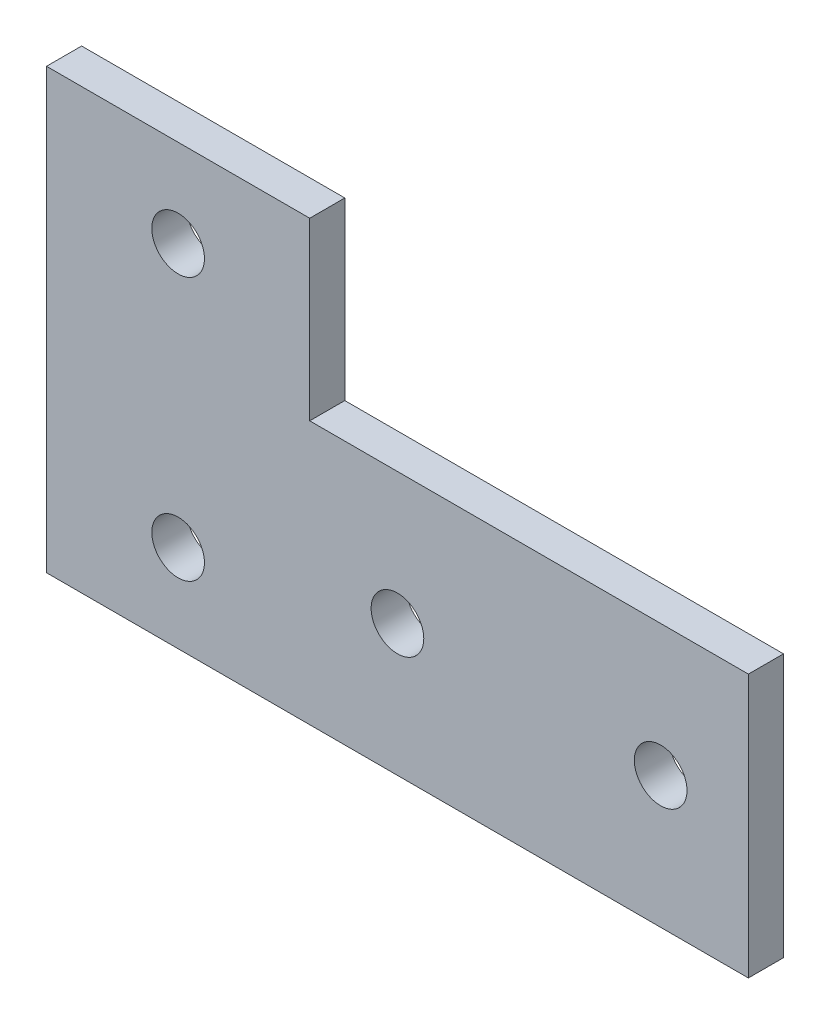
ISO-10303-21;
HEADER;
FILE_DESCRIPTION(('STEP AP214'),'2;1');
FILE_NAME('part.step','',(''),(''),'','','');
FILE_SCHEMA(('AUTOMOTIVE_DESIGN { 1 0 10303 214 1 1 1 1 }'));
ENDSEC;
DATA;
#1=APPLICATION_CONTEXT('core data for automotive mechanical design processes');
#2=APPLICATION_PROTOCOL_DEFINITION('international standard','automotive_design',2000,#1);
#3=PRODUCT_CONTEXT('',#1,'mechanical');
#4=PRODUCT('Part','Part','',(#3));
#5=PRODUCT_RELATED_PRODUCT_CATEGORY('part','',(#4));
#6=PRODUCT_DEFINITION_FORMATION('','',#4);
#7=PRODUCT_DEFINITION_CONTEXT('part definition',#1,'design');
#8=PRODUCT_DEFINITION('design','',#6,#7);
#9=PRODUCT_DEFINITION_SHAPE('','',#8);
#10=(LENGTH_UNIT() NAMED_UNIT(*) SI_UNIT(.MILLI.,.METRE.));
#11=(NAMED_UNIT(*) PLANE_ANGLE_UNIT() SI_UNIT($,.RADIAN.));
#12=(NAMED_UNIT(*) SI_UNIT($,.STERADIAN.) SOLID_ANGLE_UNIT());
#13=UNCERTAINTY_MEASURE_WITH_UNIT(LENGTH_MEASURE(1.E-05),#10,'distance_accuracy_value','');
#14=(GEOMETRIC_REPRESENTATION_CONTEXT(3) GLOBAL_UNCERTAINTY_ASSIGNED_CONTEXT((#13)) GLOBAL_UNIT_ASSIGNED_CONTEXT((#10,
#11,#12)) REPRESENTATION_CONTEXT('',''));
#15=CARTESIAN_POINT('',(0.,0.,0.));
#16=DIRECTION('',(0.,0.,1.));
#17=DIRECTION('',(1.,0.,0.));
#18=AXIS2_PLACEMENT_3D('',#15,#16,#17);
#19=CARTESIAN_POINT('',(0.,0.,2.));
#20=DIRECTION('',(1.,0.,0.));
#21=DIRECTION('',(0.,0.,-1.));
#22=AXIS2_PLACEMENT_3D('',#19,#20,#21);
#23=PLANE('',#22);
#24=DIRECTION('',(0.,-1.,0.));
#25=VECTOR('',#24,1.);
#26=CARTESIAN_POINT('',(0.,0.,0.));
#27=LINE('',#26,#25);
#28=CARTESIAN_POINT('',(0.,25.,0.));
#29=VERTEX_POINT('',#28);
#30=CARTESIAN_POINT('',(0.,0.,0.));
#31=VERTEX_POINT('',#30);
#32=EDGE_CURVE('E115',#29,#31,#27,.T.);
#33=ORIENTED_EDGE('',*,*,#32,.T.);
#34=DIRECTION('',(0.,0.,-1.));
#35=VECTOR('',#34,1.);
#36=CARTESIAN_POINT('',(0.,0.,2.));
#37=LINE('',#36,#35);
#38=CARTESIAN_POINT('',(0.,0.,2.));
#39=VERTEX_POINT('',#38);
#40=EDGE_CURVE('E11',#39,#31,#37,.T.);
#41=ORIENTED_EDGE('',*,*,#40,.F.);
#42=DIRECTION('',(0.,-1.,0.));
#43=VECTOR('',#42,1.);
#44=CARTESIAN_POINT('',(0.,0.,2.));
#45=LINE('',#44,#43);
#46=CARTESIAN_POINT('',(0.,25.,2.));
#47=VERTEX_POINT('',#46);
#48=EDGE_CURVE('E126',#47,#39,#45,.T.);
#49=ORIENTED_EDGE('',*,*,#48,.F.);
#50=DIRECTION('',(0.,0.,-1.));
#51=VECTOR('',#50,1.);
#52=CARTESIAN_POINT('',(0.,25.,2.));
#53=LINE('',#52,#51);
#54=EDGE_CURVE('E111',#47,#29,#53,.T.);
#55=ORIENTED_EDGE('',*,*,#54,.T.);
#56=EDGE_LOOP('',(#33,#41,#49,#55));
#57=FACE_BOUND('',#56,.T.);
#58=ADVANCED_FACE('F31',(#57),#23,.F.);
#59=CARTESIAN_POINT('',(15.,0.,2.));
#60=DIRECTION('',(0.,1.,0.));
#61=DIRECTION('',(0.,0.,1.));
#62=AXIS2_PLACEMENT_3D('',#59,#60,#61);
#63=PLANE('',#62);
#64=DIRECTION('',(1.,0.,0.));
#65=VECTOR('',#64,1.);
#66=CARTESIAN_POINT('',(15.,0.,0.));
#67=LINE('',#66,#65);
#68=CARTESIAN_POINT('',(40.,0.,0.));
#69=VERTEX_POINT('',#68);
#70=EDGE_CURVE('E118',#31,#69,#67,.T.);
#71=ORIENTED_EDGE('',*,*,#70,.T.);
#72=DIRECTION('',(0.,0.,-1.));
#73=VECTOR('',#72,1.);
#74=CARTESIAN_POINT('',(40.,0.,2.));
#75=LINE('',#74,#73);
#76=CARTESIAN_POINT('',(40.,0.,2.));
#77=VERTEX_POINT('',#76);
#78=EDGE_CURVE('E39',#77,#69,#75,.T.);
#79=ORIENTED_EDGE('',*,*,#78,.F.);
#80=DIRECTION('',(1.,0.,0.));
#81=VECTOR('',#80,1.);
#82=CARTESIAN_POINT('',(0.,0.,2.));
#83=LINE('',#82,#81);
#84=EDGE_CURVE('E84',#39,#77,#83,.T.);
#85=ORIENTED_EDGE('',*,*,#84,.F.);
#86=ORIENTED_EDGE('',*,*,#40,.T.);
#87=EDGE_LOOP('',(#71,#79,#85,#86));
#88=FACE_BOUND('',#87,.T.);
#89=ADVANCED_FACE('F151',(#88),#63,.F.);
#90=CARTESIAN_POINT('',(40.,0.,2.));
#91=DIRECTION('',(-1.,0.,0.));
#92=DIRECTION('',(0.,0.,1.));
#93=AXIS2_PLACEMENT_3D('',#90,#91,#92);
#94=PLANE('',#93);
#95=DIRECTION('',(0.,1.,0.));
#96=VECTOR('',#95,1.);
#97=CARTESIAN_POINT('',(40.,0.,0.));
#98=LINE('',#97,#96);
#99=CARTESIAN_POINT('',(40.,15.,0.));
#100=VERTEX_POINT('',#99);
#101=EDGE_CURVE('E121',#69,#100,#98,.T.);
#102=ORIENTED_EDGE('',*,*,#101,.T.);
#103=DIRECTION('',(0.,0.,-1.));
#104=VECTOR('',#103,1.);
#105=CARTESIAN_POINT('',(40.,15.,2.));
#106=LINE('',#105,#104);
#107=CARTESIAN_POINT('',(40.,15.,2.));
#108=VERTEX_POINT('',#107);
#109=EDGE_CURVE('E106',#108,#100,#106,.T.);
#110=ORIENTED_EDGE('',*,*,#109,.F.);
#111=DIRECTION('',(0.,1.,0.));
#112=VECTOR('',#111,1.);
#113=CARTESIAN_POINT('',(40.,0.,2.));
#114=LINE('',#113,#112);
#115=EDGE_CURVE('E97',#77,#108,#114,.T.);
#116=ORIENTED_EDGE('',*,*,#115,.F.);
#117=ORIENTED_EDGE('',*,*,#78,.T.);
#118=EDGE_LOOP('',(#102,#110,#116,#117));
#119=FACE_BOUND('',#118,.T.);
#120=ADVANCED_FACE('F132',(#119),#94,.F.);
#121=CARTESIAN_POINT('',(15.,15.,2.));
#122=DIRECTION('',(0.,-1.,0.));
#123=DIRECTION('',(0.,0.,-1.));
#124=AXIS2_PLACEMENT_3D('',#121,#122,#123);
#125=PLANE('',#124);
#126=DIRECTION('',(-1.,0.,0.));
#127=VECTOR('',#126,1.);
#128=CARTESIAN_POINT('',(15.,15.,0.));
#129=LINE('',#128,#127);
#130=CARTESIAN_POINT('',(15.,15.,0.));
#131=VERTEX_POINT('',#130);
#132=EDGE_CURVE('E105',#100,#131,#129,.T.);
#133=ORIENTED_EDGE('',*,*,#132,.T.);
#134=DIRECTION('',(0.,0.,-1.));
#135=VECTOR('',#134,1.);
#136=CARTESIAN_POINT('',(15.,15.,2.));
#137=LINE('',#136,#135);
#138=CARTESIAN_POINT('',(15.,15.,2.));
#139=VERTEX_POINT('',#138);
#140=EDGE_CURVE('E102',#139,#131,#137,.T.);
#141=ORIENTED_EDGE('',*,*,#140,.F.);
#142=DIRECTION('',(-1.,0.,0.));
#143=VECTOR('',#142,1.);
#144=CARTESIAN_POINT('',(15.,15.,2.));
#145=LINE('',#144,#143);
#146=EDGE_CURVE('E91',#108,#139,#145,.T.);
#147=ORIENTED_EDGE('',*,*,#146,.F.);
#148=ORIENTED_EDGE('',*,*,#109,.T.);
#149=EDGE_LOOP('',(#133,#141,#147,#148));
#150=FACE_BOUND('',#149,.T.);
#151=ADVANCED_FACE('F103',(#150),#125,.F.);
#152=CARTESIAN_POINT('',(15.,15.,2.));
#153=DIRECTION('',(-1.,0.,0.));
#154=DIRECTION('',(0.,0.,1.));
#155=AXIS2_PLACEMENT_3D('',#152,#153,#154);
#156=PLANE('',#155);
#157=DIRECTION('',(0.,1.,0.));
#158=VECTOR('',#157,1.);
#159=CARTESIAN_POINT('',(15.,15.,0.));
#160=LINE('',#159,#158);
#161=CARTESIAN_POINT('',(15.,25.,0.));
#162=VERTEX_POINT('',#161);
#163=EDGE_CURVE('E70',#131,#162,#160,.T.);
#164=ORIENTED_EDGE('',*,*,#163,.T.);
#165=DIRECTION('',(0.,0.,-1.));
#166=VECTOR('',#165,1.);
#167=CARTESIAN_POINT('',(15.,25.,2.));
#168=LINE('',#167,#166);
#169=CARTESIAN_POINT('',(15.,25.,2.));
#170=VERTEX_POINT('',#169);
#171=EDGE_CURVE('E107',#170,#162,#168,.T.);
#172=ORIENTED_EDGE('',*,*,#171,.F.);
#173=DIRECTION('',(0.,1.,0.));
#174=VECTOR('',#173,1.);
#175=CARTESIAN_POINT('',(15.,15.,2.));
#176=LINE('',#175,#174);
#177=EDGE_CURVE('E95',#139,#170,#176,.T.);
#178=ORIENTED_EDGE('',*,*,#177,.F.);
#179=ORIENTED_EDGE('',*,*,#140,.T.);
#180=EDGE_LOOP('',(#164,#172,#178,#179));
#181=FACE_BOUND('',#180,.T.);
#182=ADVANCED_FACE('F109',(#181),#156,.F.);
#183=CARTESIAN_POINT('',(0.,25.,2.));
#184=DIRECTION('',(0.,-1.,0.));
#185=DIRECTION('',(0.,0.,-1.));
#186=AXIS2_PLACEMENT_3D('',#183,#184,#185);
#187=PLANE('',#186);
#188=DIRECTION('',(-1.,0.,0.));
#189=VECTOR('',#188,1.);
#190=CARTESIAN_POINT('',(0.,25.,0.));
#191=LINE('',#190,#189);
#192=EDGE_CURVE('E76',#162,#29,#191,.T.);
#193=ORIENTED_EDGE('',*,*,#192,.T.);
#194=ORIENTED_EDGE('',*,*,#54,.F.);
#195=DIRECTION('',(-1.,0.,0.));
#196=VECTOR('',#195,1.);
#197=CARTESIAN_POINT('',(0.,25.,2.));
#198=LINE('',#197,#196);
#199=EDGE_CURVE('E47',#170,#47,#198,.T.);
#200=ORIENTED_EDGE('',*,*,#199,.F.);
#201=ORIENTED_EDGE('',*,*,#171,.T.);
#202=EDGE_LOOP('',(#193,#194,#200,#201));
#203=FACE_BOUND('',#202,.T.);
#204=ADVANCED_FACE('F139',(#203),#187,.F.);
#205=CARTESIAN_POINT('',(0.,25.,2.));
#206=DIRECTION('',(0.,0.,-1.));
#207=DIRECTION('',(-1.,0.,0.));
#208=AXIS2_PLACEMENT_3D('',#205,#206,#207);
#209=PLANE('',#208);
#210=CARTESIAN_POINT('',(35.,7.5,2.));
#211=DIRECTION('',(0.,0.,1.));
#212=DIRECTION('',(1.,0.,0.));
#213=AXIS2_PLACEMENT_3D('',#210,#211,#212);
#214=CIRCLE('',#213,1.5);
#215=CARTESIAN_POINT('',(36.5,7.5,2.));
#216=VERTEX_POINT('',#215);
#217=EDGE_CURVE('E237',#216,#216,#214,.T.);
#218=ORIENTED_EDGE('',*,*,#217,.F.);
#219=EDGE_LOOP('',(#218));
#220=FACE_BOUND('',#219,.T.);
#221=CARTESIAN_POINT('',(20.,7.5,2.));
#222=DIRECTION('',(0.,0.,1.));
#223=DIRECTION('',(1.,0.,0.));
#224=AXIS2_PLACEMENT_3D('',#221,#222,#223);
#225=CIRCLE('',#224,1.5);
#226=CARTESIAN_POINT('',(21.5,7.5,2.));
#227=VERTEX_POINT('',#226);
#228=EDGE_CURVE('E239',#227,#227,#225,.T.);
#229=ORIENTED_EDGE('',*,*,#228,.F.);
#230=EDGE_LOOP('',(#229));
#231=FACE_BOUND('',#230,.T.);
#232=CARTESIAN_POINT('',(7.5,5.,2.));
#233=DIRECTION('',(0.,0.,1.));
#234=DIRECTION('',(1.,0.,0.));
#235=AXIS2_PLACEMENT_3D('',#232,#233,#234);
#236=CIRCLE('',#235,1.5);
#237=CARTESIAN_POINT('',(9.,5.,2.));
#238=VERTEX_POINT('',#237);
#239=EDGE_CURVE('E245',#238,#238,#236,.T.);
#240=ORIENTED_EDGE('',*,*,#239,.F.);
#241=EDGE_LOOP('',(#240));
#242=FACE_BOUND('',#241,.T.);
#243=CARTESIAN_POINT('',(7.5,20.,2.));
#244=DIRECTION('',(0.,0.,1.));
#245=DIRECTION('',(1.,0.,0.));
#246=AXIS2_PLACEMENT_3D('',#243,#244,#245);
#247=CIRCLE('',#246,1.5);
#248=CARTESIAN_POINT('',(9.,20.,2.));
#249=VERTEX_POINT('',#248);
#250=EDGE_CURVE('E251',#249,#249,#247,.T.);
#251=ORIENTED_EDGE('',*,*,#250,.F.);
#252=EDGE_LOOP('',(#251));
#253=FACE_BOUND('',#252,.T.);
#254=ORIENTED_EDGE('',*,*,#48,.T.);
#255=ORIENTED_EDGE('',*,*,#84,.T.);
#256=ORIENTED_EDGE('',*,*,#115,.T.);
#257=ORIENTED_EDGE('',*,*,#146,.T.);
#258=ORIENTED_EDGE('',*,*,#177,.T.);
#259=ORIENTED_EDGE('',*,*,#199,.T.);
#260=EDGE_LOOP('',(#254,#255,#256,#257,#258,#259));
#261=FACE_BOUND('',#260,.T.);
#262=ADVANCED_FACE('F93',(#220,#231,#242,#253,#261),#209,.F.);
#263=CARTESIAN_POINT('',(0.,25.,0.));
#264=DIRECTION('',(0.,0.,-1.));
#265=DIRECTION('',(-1.,0.,0.));
#266=AXIS2_PLACEMENT_3D('',#263,#264,#265);
#267=PLANE('',#266);
#268=CARTESIAN_POINT('',(35.,7.5,0.));
#269=DIRECTION('',(0.,0.,1.));
#270=DIRECTION('',(1.,0.,0.));
#271=AXIS2_PLACEMENT_3D('',#268,#269,#270);
#272=CIRCLE('',#271,1.5);
#273=CARTESIAN_POINT('',(36.5,7.5,0.));
#274=VERTEX_POINT('',#273);
#275=EDGE_CURVE('E234',#274,#274,#272,.T.);
#276=ORIENTED_EDGE('',*,*,#275,.T.);
#277=EDGE_LOOP('',(#276));
#278=FACE_BOUND('',#277,.T.);
#279=CARTESIAN_POINT('',(20.,7.5,0.));
#280=DIRECTION('',(0.,0.,1.));
#281=DIRECTION('',(1.,0.,0.));
#282=AXIS2_PLACEMENT_3D('',#279,#280,#281);
#283=CIRCLE('',#282,1.5);
#284=CARTESIAN_POINT('',(21.5,7.5,0.));
#285=VERTEX_POINT('',#284);
#286=EDGE_CURVE('E242',#285,#285,#283,.T.);
#287=ORIENTED_EDGE('',*,*,#286,.T.);
#288=EDGE_LOOP('',(#287));
#289=FACE_BOUND('',#288,.T.);
#290=CARTESIAN_POINT('',(7.5,5.,0.));
#291=DIRECTION('',(0.,0.,1.));
#292=DIRECTION('',(1.,0.,0.));
#293=AXIS2_PLACEMENT_3D('',#290,#291,#292);
#294=CIRCLE('',#293,1.5);
#295=CARTESIAN_POINT('',(9.,5.,0.));
#296=VERTEX_POINT('',#295);
#297=EDGE_CURVE('E248',#296,#296,#294,.T.);
#298=ORIENTED_EDGE('',*,*,#297,.T.);
#299=EDGE_LOOP('',(#298));
#300=FACE_BOUND('',#299,.T.);
#301=CARTESIAN_POINT('',(7.5,20.,0.));
#302=DIRECTION('',(0.,0.,1.));
#303=DIRECTION('',(1.,0.,0.));
#304=AXIS2_PLACEMENT_3D('',#301,#302,#303);
#305=CIRCLE('',#304,1.5);
#306=CARTESIAN_POINT('',(9.,20.,0.));
#307=VERTEX_POINT('',#306);
#308=EDGE_CURVE('E119',#307,#307,#305,.T.);
#309=ORIENTED_EDGE('',*,*,#308,.T.);
#310=EDGE_LOOP('',(#309));
#311=FACE_BOUND('',#310,.T.);
#312=ORIENTED_EDGE('',*,*,#32,.F.);
#313=ORIENTED_EDGE('',*,*,#192,.F.);
#314=ORIENTED_EDGE('',*,*,#163,.F.);
#315=ORIENTED_EDGE('',*,*,#132,.F.);
#316=ORIENTED_EDGE('',*,*,#101,.F.);
#317=ORIENTED_EDGE('',*,*,#70,.F.);
#318=EDGE_LOOP('',(#312,#313,#314,#315,#316,#317));
#319=FACE_BOUND('',#318,.T.);
#320=ADVANCED_FACE('F135',(#278,#289,#300,#311,#319),#267,.T.);
#321=CARTESIAN_POINT('',(7.5,20.,0.));
#322=DIRECTION('',(0.,0.,1.));
#323=DIRECTION('',(1.,0.,0.));
#324=AXIS2_PLACEMENT_3D('',#321,#322,#323);
#325=CYLINDRICAL_SURFACE('',#324,1.5);
#326=ORIENTED_EDGE('',*,*,#308,.F.);
#327=EDGE_LOOP('',(#326));
#328=FACE_BOUND('',#327,.T.);
#329=ORIENTED_EDGE('',*,*,#250,.T.);
#330=EDGE_LOOP('',(#329));
#331=FACE_BOUND('',#330,.T.);
#332=ADVANCED_FACE('F188',(#328,#331),#325,.F.);
#333=CARTESIAN_POINT('',(7.5,5.,0.));
#334=DIRECTION('',(0.,0.,1.));
#335=DIRECTION('',(1.,0.,0.));
#336=AXIS2_PLACEMENT_3D('',#333,#334,#335);
#337=CYLINDRICAL_SURFACE('',#336,1.5);
#338=ORIENTED_EDGE('',*,*,#297,.F.);
#339=EDGE_LOOP('',(#338));
#340=FACE_BOUND('',#339,.T.);
#341=ORIENTED_EDGE('',*,*,#239,.T.);
#342=EDGE_LOOP('',(#341));
#343=FACE_BOUND('',#342,.T.);
#344=ADVANCED_FACE('F197',(#340,#343),#337,.F.);
#345=CARTESIAN_POINT('',(20.,7.5,0.));
#346=DIRECTION('',(0.,0.,1.));
#347=DIRECTION('',(1.,0.,0.));
#348=AXIS2_PLACEMENT_3D('',#345,#346,#347);
#349=CYLINDRICAL_SURFACE('',#348,1.5);
#350=ORIENTED_EDGE('',*,*,#286,.F.);
#351=EDGE_LOOP('',(#350));
#352=FACE_BOUND('',#351,.T.);
#353=ORIENTED_EDGE('',*,*,#228,.T.);
#354=EDGE_LOOP('',(#353));
#355=FACE_BOUND('',#354,.T.);
#356=ADVANCED_FACE('F207',(#352,#355),#349,.F.);
#357=CARTESIAN_POINT('',(35.,7.5,0.));
#358=DIRECTION('',(0.,0.,1.));
#359=DIRECTION('',(1.,0.,0.));
#360=AXIS2_PLACEMENT_3D('',#357,#358,#359);
#361=CYLINDRICAL_SURFACE('',#360,1.5);
#362=ORIENTED_EDGE('',*,*,#275,.F.);
#363=EDGE_LOOP('',(#362));
#364=FACE_BOUND('',#363,.T.);
#365=ORIENTED_EDGE('',*,*,#217,.T.);
#366=EDGE_LOOP('',(#365));
#367=FACE_BOUND('',#366,.T.);
#368=ADVANCED_FACE('F217',(#364,#367),#361,.F.);
#369=CLOSED_SHELL('',(#58,#89,#120,#151,#182,#204,#262,#320,#332,#344,#356,#368));
#370=MANIFOLD_SOLID_BREP('B2',#369);
#371=ADVANCED_BREP_SHAPE_REPRESENTATION('',(#18,#370),#14);
#372=SHAPE_DEFINITION_REPRESENTATION(#9,#371);
ENDSEC;
END-ISO-10303-21;
